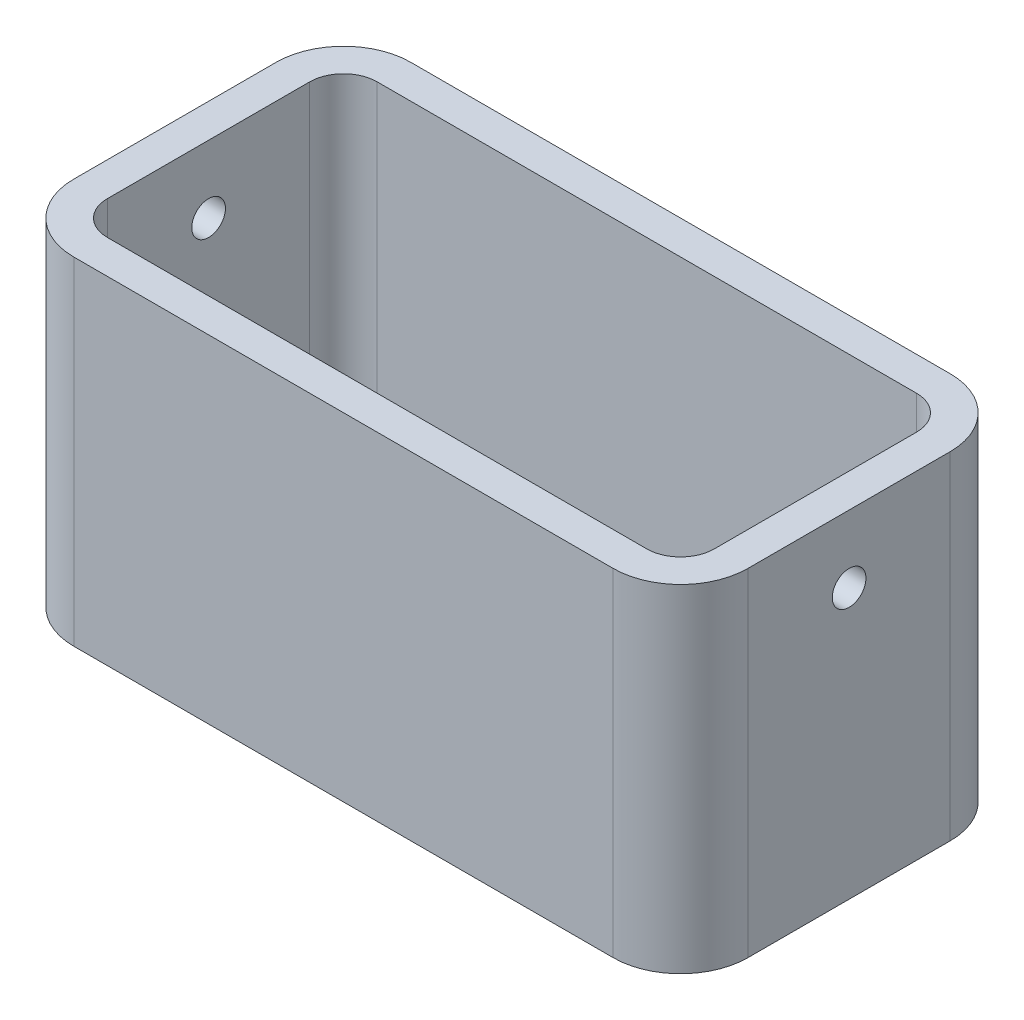
ISO-10303-21;
HEADER;
FILE_DESCRIPTION(('STEP AP214'),'2;1');
FILE_NAME('part.step','',(''),(''),'','','');
FILE_SCHEMA(('AUTOMOTIVE_DESIGN { 1 0 10303 214 1 1 1 1 }'));
ENDSEC;
DATA;
#1=APPLICATION_CONTEXT('core data for automotive mechanical design processes');
#2=APPLICATION_PROTOCOL_DEFINITION('international standard','automotive_design',2000,#1);
#3=PRODUCT_CONTEXT('',#1,'mechanical');
#4=PRODUCT('Part','Part','',(#3));
#5=PRODUCT_RELATED_PRODUCT_CATEGORY('part','',(#4));
#6=PRODUCT_DEFINITION_FORMATION('','',#4);
#7=PRODUCT_DEFINITION_CONTEXT('part definition',#1,'design');
#8=PRODUCT_DEFINITION('design','',#6,#7);
#9=PRODUCT_DEFINITION_SHAPE('','',#8);
#10=(LENGTH_UNIT() NAMED_UNIT(*) SI_UNIT(.MILLI.,.METRE.));
#11=(NAMED_UNIT(*) PLANE_ANGLE_UNIT() SI_UNIT($,.RADIAN.));
#12=(NAMED_UNIT(*) SI_UNIT($,.STERADIAN.) SOLID_ANGLE_UNIT());
#13=UNCERTAINTY_MEASURE_WITH_UNIT(LENGTH_MEASURE(1.E-05),#10,'distance_accuracy_value','');
#14=(GEOMETRIC_REPRESENTATION_CONTEXT(3) GLOBAL_UNCERTAINTY_ASSIGNED_CONTEXT((#13)) GLOBAL_UNIT_ASSIGNED_CONTEXT((#10,
#11,#12)) REPRESENTATION_CONTEXT('',''));
#15=CARTESIAN_POINT('',(0.,0.,0.));
#16=DIRECTION('',(0.,0.,1.));
#17=DIRECTION('',(1.,0.,0.));
#18=AXIS2_PLACEMENT_3D('',#15,#16,#17);
#19=CARTESIAN_POINT('',(-50.,50.,-25.));
#20=DIRECTION('',(1.,0.,0.));
#21=DIRECTION('',(0.,0.,-1.));
#22=AXIS2_PLACEMENT_3D('',#19,#20,#21);
#23=PLANE('',#22);
#24=CARTESIAN_POINT('',(-50.,40.,0.));
#25=DIRECTION('',(1.,0.,0.));
#26=DIRECTION('',(0.,0.,-1.));
#27=AXIS2_PLACEMENT_3D('',#24,#25,#26);
#28=CIRCLE('',#27,2.5);
#29=CARTESIAN_POINT('',(-50.,40.,-2.49999999999999));
#30=VERTEX_POINT('',#29);
#31=EDGE_CURVE('E500',#30,#30,#28,.T.);
#32=ORIENTED_EDGE('',*,*,#31,.T.);
#33=EDGE_LOOP('',(#32));
#34=FACE_BOUND('',#33,.T.);
#35=DIRECTION('',(0.,0.,1.));
#36=VECTOR('',#35,1.);
#37=CARTESIAN_POINT('',(-50.,0.,-25.));
#38=LINE('',#37,#36);
#39=CARTESIAN_POINT('',(-50.,0.,-15.));
#40=VERTEX_POINT('',#39);
#41=CARTESIAN_POINT('',(-50.,0.,15.));
#42=VERTEX_POINT('',#41);
#43=EDGE_CURVE('E206',#40,#42,#38,.T.);
#44=ORIENTED_EDGE('',*,*,#43,.T.);
#45=DIRECTION('',(0.,-1.,0.));
#46=VECTOR('',#45,1.);
#47=CARTESIAN_POINT('',(-50.,50.,15.));
#48=LINE('',#47,#46);
#49=CARTESIAN_POINT('',(-50.,50.,15.));
#50=VERTEX_POINT('',#49);
#51=EDGE_CURVE('E261',#42,#50,#48,.F.);
#52=ORIENTED_EDGE('',*,*,#51,.T.);
#53=DIRECTION('',(0.,0.,1.));
#54=VECTOR('',#53,1.);
#55=CARTESIAN_POINT('',(-50.,50.,-25.));
#56=LINE('',#55,#54);
#57=CARTESIAN_POINT('',(-50.,50.,-15.));
#58=VERTEX_POINT('',#57);
#59=EDGE_CURVE('E224',#58,#50,#56,.T.);
#60=ORIENTED_EDGE('',*,*,#59,.F.);
#61=DIRECTION('',(0.,-1.,0.));
#62=VECTOR('',#61,1.);
#63=CARTESIAN_POINT('',(-50.,50.,-15.));
#64=LINE('',#63,#62);
#65=EDGE_CURVE('E258',#58,#40,#64,.T.);
#66=ORIENTED_EDGE('',*,*,#65,.T.);
#67=EDGE_LOOP('',(#44,#52,#60,#66));
#68=FACE_BOUND('',#67,.T.);
#69=ADVANCED_FACE('F35',(#34,#68),#23,.F.);
#70=CARTESIAN_POINT('',(-50.,50.,25.));
#71=DIRECTION('',(0.,0.,-1.));
#72=DIRECTION('',(-1.,0.,0.));
#73=AXIS2_PLACEMENT_3D('',#70,#71,#72);
#74=PLANE('',#73);
#75=DIRECTION('',(1.,0.,0.));
#76=VECTOR('',#75,1.);
#77=CARTESIAN_POINT('',(-50.,50.,25.));
#78=LINE('',#77,#76);
#79=CARTESIAN_POINT('',(-40.,50.,25.));
#80=VERTEX_POINT('',#79);
#81=CARTESIAN_POINT('',(40.,50.,25.));
#82=VERTEX_POINT('',#81);
#83=EDGE_CURVE('E227',#80,#82,#78,.T.);
#84=ORIENTED_EDGE('',*,*,#83,.F.);
#85=DIRECTION('',(0.,-1.,0.));
#86=VECTOR('',#85,1.);
#87=CARTESIAN_POINT('',(-40.,50.,25.));
#88=LINE('',#87,#86);
#89=CARTESIAN_POINT('',(-40.,0.,25.));
#90=VERTEX_POINT('',#89);
#91=EDGE_CURVE('E247',#80,#90,#88,.T.);
#92=ORIENTED_EDGE('',*,*,#91,.T.);
#93=DIRECTION('',(1.,0.,0.));
#94=VECTOR('',#93,1.);
#95=CARTESIAN_POINT('',(-50.,0.,25.));
#96=LINE('',#95,#94);
#97=CARTESIAN_POINT('',(40.,0.,25.));
#98=VERTEX_POINT('',#97);
#99=EDGE_CURVE('E239',#90,#98,#96,.T.);
#100=ORIENTED_EDGE('',*,*,#99,.T.);
#101=DIRECTION('',(0.,-1.,0.));
#102=VECTOR('',#101,1.);
#103=CARTESIAN_POINT('',(40.,50.,25.));
#104=LINE('',#103,#102);
#105=EDGE_CURVE('E236',#98,#82,#104,.F.);
#106=ORIENTED_EDGE('',*,*,#105,.T.);
#107=EDGE_LOOP('',(#84,#92,#100,#106));
#108=FACE_BOUND('',#107,.T.);
#109=ADVANCED_FACE('F309',(#108),#74,.F.);
#110=CARTESIAN_POINT('',(50.,50.,-25.));
#111=DIRECTION('',(-1.,0.,0.));
#112=DIRECTION('',(0.,0.,1.));
#113=AXIS2_PLACEMENT_3D('',#110,#111,#112);
#114=PLANE('',#113);
#115=CARTESIAN_POINT('',(50.,40.,0.));
#116=DIRECTION('',(1.,0.,0.));
#117=DIRECTION('',(0.,0.,-1.));
#118=AXIS2_PLACEMENT_3D('',#115,#116,#117);
#119=CIRCLE('',#118,2.5);
#120=CARTESIAN_POINT('',(50.,40.,-2.50000000000001));
#121=VERTEX_POINT('',#120);
#122=EDGE_CURVE('E501',#121,#121,#119,.T.);
#123=ORIENTED_EDGE('',*,*,#122,.F.);
#124=EDGE_LOOP('',(#123));
#125=FACE_BOUND('',#124,.T.);
#126=DIRECTION('',(0.,0.,-1.));
#127=VECTOR('',#126,1.);
#128=CARTESIAN_POINT('',(50.,0.,-25.));
#129=LINE('',#128,#127);
#130=CARTESIAN_POINT('',(50.,0.,15.));
#131=VERTEX_POINT('',#130);
#132=CARTESIAN_POINT('',(50.,0.,-15.));
#133=VERTEX_POINT('',#132);
#134=EDGE_CURVE('E242',#131,#133,#129,.T.);
#135=ORIENTED_EDGE('',*,*,#134,.T.);
#136=DIRECTION('',(0.,-1.,0.));
#137=VECTOR('',#136,1.);
#138=CARTESIAN_POINT('',(50.,50.,-15.));
#139=LINE('',#138,#137);
#140=CARTESIAN_POINT('',(50.,50.,-15.));
#141=VERTEX_POINT('',#140);
#142=EDGE_CURVE('E11',#133,#141,#139,.F.);
#143=ORIENTED_EDGE('',*,*,#142,.T.);
#144=DIRECTION('',(0.,0.,-1.));
#145=VECTOR('',#144,1.);
#146=CARTESIAN_POINT('',(50.,50.,-25.));
#147=LINE('',#146,#145);
#148=CARTESIAN_POINT('',(50.,50.,15.));
#149=VERTEX_POINT('',#148);
#150=EDGE_CURVE('E231',#149,#141,#147,.T.);
#151=ORIENTED_EDGE('',*,*,#150,.F.);
#152=DIRECTION('',(0.,-1.,0.));
#153=VECTOR('',#152,1.);
#154=CARTESIAN_POINT('',(50.,50.,15.));
#155=LINE('',#154,#153);
#156=EDGE_CURVE('E44',#149,#131,#155,.T.);
#157=ORIENTED_EDGE('',*,*,#156,.T.);
#158=EDGE_LOOP('',(#135,#143,#151,#157));
#159=FACE_BOUND('',#158,.T.);
#160=ADVANCED_FACE('F280',(#125,#159),#114,.F.);
#161=CARTESIAN_POINT('',(-50.,50.,-25.));
#162=DIRECTION('',(0.,0.,1.));
#163=DIRECTION('',(1.,0.,0.));
#164=AXIS2_PLACEMENT_3D('',#161,#162,#163);
#165=PLANE('',#164);
#166=DIRECTION('',(-1.,0.,0.));
#167=VECTOR('',#166,1.);
#168=CARTESIAN_POINT('',(-50.,0.,-25.));
#169=LINE('',#168,#167);
#170=CARTESIAN_POINT('',(40.,0.,-25.));
#171=VERTEX_POINT('',#170);
#172=CARTESIAN_POINT('',(-40.,0.,-25.));
#173=VERTEX_POINT('',#172);
#174=EDGE_CURVE('E228',#171,#173,#169,.T.);
#175=ORIENTED_EDGE('',*,*,#174,.T.);
#176=DIRECTION('',(0.,-1.,0.));
#177=VECTOR('',#176,1.);
#178=CARTESIAN_POINT('',(-40.,50.,-25.));
#179=LINE('',#178,#177);
#180=CARTESIAN_POINT('',(-40.,50.,-25.));
#181=VERTEX_POINT('',#180);
#182=EDGE_CURVE('E59',#173,#181,#179,.F.);
#183=ORIENTED_EDGE('',*,*,#182,.T.);
#184=DIRECTION('',(-1.,0.,0.));
#185=VECTOR('',#184,1.);
#186=CARTESIAN_POINT('',(-50.,50.,-25.));
#187=LINE('',#186,#185);
#188=CARTESIAN_POINT('',(40.,50.,-25.));
#189=VERTEX_POINT('',#188);
#190=EDGE_CURVE('E234',#189,#181,#187,.T.);
#191=ORIENTED_EDGE('',*,*,#190,.F.);
#192=DIRECTION('',(0.,-1.,0.));
#193=VECTOR('',#192,1.);
#194=CARTESIAN_POINT('',(40.,50.,-25.));
#195=LINE('',#194,#193);
#196=EDGE_CURVE('E271',#189,#171,#195,.T.);
#197=ORIENTED_EDGE('',*,*,#196,.T.);
#198=EDGE_LOOP('',(#175,#183,#191,#197));
#199=FACE_BOUND('',#198,.T.);
#200=ADVANCED_FACE('F292',(#199),#165,.F.);
#201=CARTESIAN_POINT('',(-50.,50.,25.));
#202=DIRECTION('',(0.,1.,0.));
#203=DIRECTION('',(0.,0.,1.));
#204=AXIS2_PLACEMENT_3D('',#201,#202,#203);
#205=PLANE('',#204);
#206=DIRECTION('',(0.,0.,1.));
#207=VECTOR('',#206,1.);
#208=CARTESIAN_POINT('',(-45.,50.,-25.));
#209=LINE('',#208,#207);
#210=CARTESIAN_POINT('',(-45.,50.,-15.));
#211=VERTEX_POINT('',#210);
#212=CARTESIAN_POINT('',(-45.,50.,15.));
#213=VERTEX_POINT('',#212);
#214=EDGE_CURVE('E177',#211,#213,#209,.T.);
#215=ORIENTED_EDGE('',*,*,#214,.F.);
#216=CARTESIAN_POINT('',(-40.,50.,-15.));
#217=DIRECTION('',(0.,1.,0.));
#218=DIRECTION('',(0.,0.,1.));
#219=AXIS2_PLACEMENT_3D('',#216,#217,#218);
#220=CIRCLE('',#219,5.);
#221=CARTESIAN_POINT('',(-40.,50.,-20.));
#222=VERTEX_POINT('',#221);
#223=EDGE_CURVE('E215',#222,#211,#220,.T.);
#224=ORIENTED_EDGE('',*,*,#223,.F.);
#225=DIRECTION('',(-1.,0.,0.));
#226=VECTOR('',#225,1.);
#227=CARTESIAN_POINT('',(-50.,50.,-20.));
#228=LINE('',#227,#226);
#229=CARTESIAN_POINT('',(40.,50.,-20.));
#230=VERTEX_POINT('',#229);
#231=EDGE_CURVE('E51',#230,#222,#228,.T.);
#232=ORIENTED_EDGE('',*,*,#231,.F.);
#233=CARTESIAN_POINT('',(40.,50.,-15.));
#234=DIRECTION('',(0.,1.,0.));
#235=DIRECTION('',(0.,0.,1.));
#236=AXIS2_PLACEMENT_3D('',#233,#234,#235);
#237=CIRCLE('',#236,5.);
#238=CARTESIAN_POINT('',(45.,50.,-15.));
#239=VERTEX_POINT('',#238);
#240=EDGE_CURVE('E181',#239,#230,#237,.T.);
#241=ORIENTED_EDGE('',*,*,#240,.F.);
#242=DIRECTION('',(0.,0.,-1.));
#243=VECTOR('',#242,1.);
#244=CARTESIAN_POINT('',(45.,50.,-25.));
#245=LINE('',#244,#243);
#246=CARTESIAN_POINT('',(45.,50.,15.));
#247=VERTEX_POINT('',#246);
#248=EDGE_CURVE('E217',#247,#239,#245,.T.);
#249=ORIENTED_EDGE('',*,*,#248,.F.);
#250=CARTESIAN_POINT('',(40.,50.,15.));
#251=DIRECTION('',(0.,1.,0.));
#252=DIRECTION('',(0.,0.,1.));
#253=AXIS2_PLACEMENT_3D('',#250,#251,#252);
#254=CIRCLE('',#253,5.);
#255=CARTESIAN_POINT('',(40.,50.,20.));
#256=VERTEX_POINT('',#255);
#257=EDGE_CURVE('E179',#256,#247,#254,.T.);
#258=ORIENTED_EDGE('',*,*,#257,.F.);
#259=DIRECTION('',(1.,0.,0.));
#260=VECTOR('',#259,1.);
#261=CARTESIAN_POINT('',(-50.,50.,20.));
#262=LINE('',#261,#260);
#263=CARTESIAN_POINT('',(-40.,50.,20.));
#264=VERTEX_POINT('',#263);
#265=EDGE_CURVE('E213',#264,#256,#262,.T.);
#266=ORIENTED_EDGE('',*,*,#265,.F.);
#267=CARTESIAN_POINT('',(-40.,50.,15.));
#268=DIRECTION('',(0.,1.,0.));
#269=DIRECTION('',(0.,0.,1.));
#270=AXIS2_PLACEMENT_3D('',#267,#268,#269);
#271=CIRCLE('',#270,5.);
#272=EDGE_CURVE('E210',#213,#264,#271,.T.);
#273=ORIENTED_EDGE('',*,*,#272,.F.);
#274=EDGE_LOOP('',(#215,#224,#232,#241,#249,#258,#266,#273));
#275=FACE_BOUND('',#274,.T.);
#276=ORIENTED_EDGE('',*,*,#59,.T.);
#277=CARTESIAN_POINT('',(-40.,50.,15.));
#278=DIRECTION('',(0.,1.,0.));
#279=DIRECTION('',(0.,0.,1.));
#280=AXIS2_PLACEMENT_3D('',#277,#278,#279);
#281=CIRCLE('',#280,10.);
#282=EDGE_CURVE('E269',#50,#80,#281,.T.);
#283=ORIENTED_EDGE('',*,*,#282,.T.);
#284=ORIENTED_EDGE('',*,*,#83,.T.);
#285=CARTESIAN_POINT('',(40.,50.,15.));
#286=DIRECTION('',(0.,1.,0.));
#287=DIRECTION('',(0.,0.,1.));
#288=AXIS2_PLACEMENT_3D('',#285,#286,#287);
#289=CIRCLE('',#288,10.);
#290=EDGE_CURVE('E263',#82,#149,#289,.T.);
#291=ORIENTED_EDGE('',*,*,#290,.T.);
#292=ORIENTED_EDGE('',*,*,#150,.T.);
#293=CARTESIAN_POINT('',(40.,50.,-15.));
#294=DIRECTION('',(0.,1.,0.));
#295=DIRECTION('',(0.,0.,1.));
#296=AXIS2_PLACEMENT_3D('',#293,#294,#295);
#297=CIRCLE('',#296,10.);
#298=EDGE_CURVE('E265',#141,#189,#297,.T.);
#299=ORIENTED_EDGE('',*,*,#298,.T.);
#300=ORIENTED_EDGE('',*,*,#190,.T.);
#301=CARTESIAN_POINT('',(-40.,50.,-15.));
#302=DIRECTION('',(0.,1.,0.));
#303=DIRECTION('',(0.,0.,1.));
#304=AXIS2_PLACEMENT_3D('',#301,#302,#303);
#305=CIRCLE('',#304,10.);
#306=EDGE_CURVE('E267',#181,#58,#305,.T.);
#307=ORIENTED_EDGE('',*,*,#306,.T.);
#308=EDGE_LOOP('',(#276,#283,#284,#291,#292,#299,#300,#307));
#309=FACE_BOUND('',#308,.T.);
#310=ADVANCED_FACE('F295',(#275,#309),#205,.T.);
#311=CARTESIAN_POINT('',(-50.,0.,25.));
#312=DIRECTION('',(0.,1.,0.));
#313=DIRECTION('',(0.,0.,1.));
#314=AXIS2_PLACEMENT_3D('',#311,#312,#313);
#315=PLANE('',#314);
#316=ORIENTED_EDGE('',*,*,#99,.F.);
#317=CARTESIAN_POINT('',(-40.,0.,15.));
#318=DIRECTION('',(0.,1.,0.));
#319=DIRECTION('',(0.,0.,1.));
#320=AXIS2_PLACEMENT_3D('',#317,#318,#319);
#321=CIRCLE('',#320,10.);
#322=EDGE_CURVE('E256',#90,#42,#321,.F.);
#323=ORIENTED_EDGE('',*,*,#322,.T.);
#324=ORIENTED_EDGE('',*,*,#43,.F.);
#325=CARTESIAN_POINT('',(-40.,0.,-15.));
#326=DIRECTION('',(0.,1.,0.));
#327=DIRECTION('',(0.,0.,1.));
#328=AXIS2_PLACEMENT_3D('',#325,#326,#327);
#329=CIRCLE('',#328,10.);
#330=EDGE_CURVE('E254',#40,#173,#329,.F.);
#331=ORIENTED_EDGE('',*,*,#330,.T.);
#332=ORIENTED_EDGE('',*,*,#174,.F.);
#333=CARTESIAN_POINT('',(40.,0.,-15.));
#334=DIRECTION('',(0.,1.,0.));
#335=DIRECTION('',(0.,0.,1.));
#336=AXIS2_PLACEMENT_3D('',#333,#334,#335);
#337=CIRCLE('',#336,10.);
#338=EDGE_CURVE('E252',#171,#133,#337,.F.);
#339=ORIENTED_EDGE('',*,*,#338,.T.);
#340=ORIENTED_EDGE('',*,*,#134,.F.);
#341=CARTESIAN_POINT('',(40.,0.,15.));
#342=DIRECTION('',(0.,1.,0.));
#343=DIRECTION('',(0.,0.,1.));
#344=AXIS2_PLACEMENT_3D('',#341,#342,#343);
#345=CIRCLE('',#344,10.);
#346=EDGE_CURVE('E250',#131,#98,#345,.F.);
#347=ORIENTED_EDGE('',*,*,#346,.T.);
#348=EDGE_LOOP('',(#316,#323,#324,#331,#332,#339,#340,#347));
#349=FACE_BOUND('',#348,.T.);
#350=ADVANCED_FACE('F286',(#349),#315,.F.);
#351=CARTESIAN_POINT('',(-40.,50.,15.));
#352=DIRECTION('',(0.,-1.,0.));
#353=DIRECTION('',(0.,0.,-1.));
#354=AXIS2_PLACEMENT_3D('',#351,#352,#353);
#355=CYLINDRICAL_SURFACE('',#354,10.);
#356=ORIENTED_EDGE('',*,*,#282,.F.);
#357=ORIENTED_EDGE('',*,*,#51,.F.);
#358=ORIENTED_EDGE('',*,*,#322,.F.);
#359=ORIENTED_EDGE('',*,*,#91,.F.);
#360=EDGE_LOOP('',(#356,#357,#358,#359));
#361=FACE_BOUND('',#360,.T.);
#362=ADVANCED_FACE('F306',(#361),#355,.T.);
#363=CARTESIAN_POINT('',(-40.,50.,-15.));
#364=DIRECTION('',(0.,-1.,0.));
#365=DIRECTION('',(0.,0.,-1.));
#366=AXIS2_PLACEMENT_3D('',#363,#364,#365);
#367=CYLINDRICAL_SURFACE('',#366,10.);
#368=ORIENTED_EDGE('',*,*,#306,.F.);
#369=ORIENTED_EDGE('',*,*,#182,.F.);
#370=ORIENTED_EDGE('',*,*,#330,.F.);
#371=ORIENTED_EDGE('',*,*,#65,.F.);
#372=EDGE_LOOP('',(#368,#369,#370,#371));
#373=FACE_BOUND('',#372,.T.);
#374=ADVANCED_FACE('F299',(#373),#367,.T.);
#375=CARTESIAN_POINT('',(40.,50.,-15.));
#376=DIRECTION('',(0.,-1.,0.));
#377=DIRECTION('',(0.,0.,-1.));
#378=AXIS2_PLACEMENT_3D('',#375,#376,#377);
#379=CYLINDRICAL_SURFACE('',#378,10.);
#380=ORIENTED_EDGE('',*,*,#298,.F.);
#381=ORIENTED_EDGE('',*,*,#142,.F.);
#382=ORIENTED_EDGE('',*,*,#338,.F.);
#383=ORIENTED_EDGE('',*,*,#196,.F.);
#384=EDGE_LOOP('',(#380,#381,#382,#383));
#385=FACE_BOUND('',#384,.T.);
#386=ADVANCED_FACE('F291',(#385),#379,.T.);
#387=CARTESIAN_POINT('',(40.,50.,15.));
#388=DIRECTION('',(0.,-1.,0.));
#389=DIRECTION('',(0.,0.,-1.));
#390=AXIS2_PLACEMENT_3D('',#387,#388,#389);
#391=CYLINDRICAL_SURFACE('',#390,10.);
#392=ORIENTED_EDGE('',*,*,#290,.F.);
#393=ORIENTED_EDGE('',*,*,#105,.F.);
#394=ORIENTED_EDGE('',*,*,#346,.F.);
#395=ORIENTED_EDGE('',*,*,#156,.F.);
#396=EDGE_LOOP('',(#392,#393,#394,#395));
#397=FACE_BOUND('',#396,.T.);
#398=ADVANCED_FACE('F37',(#397),#391,.T.);
#399=CARTESIAN_POINT('',(-45.,50.,-25.));
#400=DIRECTION('',(1.,0.,0.));
#401=DIRECTION('',(0.,0.,-1.));
#402=AXIS2_PLACEMENT_3D('',#399,#400,#401);
#403=PLANE('',#402);
#404=CARTESIAN_POINT('',(-45.,40.,0.));
#405=DIRECTION('',(1.,0.,0.));
#406=DIRECTION('',(0.,0.,-1.));
#407=AXIS2_PLACEMENT_3D('',#404,#405,#406);
#408=CIRCLE('',#407,2.5);
#409=CARTESIAN_POINT('',(-45.,40.,-2.5));
#410=VERTEX_POINT('',#409);
#411=EDGE_CURVE('E173',#410,#410,#408,.T.);
#412=ORIENTED_EDGE('',*,*,#411,.F.);
#413=EDGE_LOOP('',(#412));
#414=FACE_BOUND('',#413,.T.);
#415=DIRECTION('',(0.,0.,1.));
#416=VECTOR('',#415,1.);
#417=CARTESIAN_POINT('',(-45.,5.,-25.));
#418=LINE('',#417,#416);
#419=CARTESIAN_POINT('',(-45.,5.,-15.));
#420=VERTEX_POINT('',#419);
#421=CARTESIAN_POINT('',(-45.,5.,15.));
#422=VERTEX_POINT('',#421);
#423=EDGE_CURVE('E166',#420,#422,#418,.T.);
#424=ORIENTED_EDGE('',*,*,#423,.F.);
#425=DIRECTION('',(0.,1.,0.));
#426=VECTOR('',#425,1.);
#427=CARTESIAN_POINT('',(-45.,50.,-15.));
#428=LINE('',#427,#426);
#429=EDGE_CURVE('E162',#211,#420,#428,.F.);
#430=ORIENTED_EDGE('',*,*,#429,.F.);
#431=ORIENTED_EDGE('',*,*,#214,.T.);
#432=DIRECTION('',(0.,1.,0.));
#433=VECTOR('',#432,1.);
#434=CARTESIAN_POINT('',(-45.,50.,15.));
#435=LINE('',#434,#433);
#436=EDGE_CURVE('E155',#422,#213,#435,.T.);
#437=ORIENTED_EDGE('',*,*,#436,.F.);
#438=EDGE_LOOP('',(#424,#430,#431,#437));
#439=FACE_BOUND('',#438,.T.);
#440=ADVANCED_FACE('F175',(#414,#439),#403,.T.);
#441=CARTESIAN_POINT('',(-50.,50.,20.));
#442=DIRECTION('',(0.,0.,-1.));
#443=DIRECTION('',(-1.,0.,0.));
#444=AXIS2_PLACEMENT_3D('',#441,#442,#443);
#445=PLANE('',#444);
#446=ORIENTED_EDGE('',*,*,#265,.T.);
#447=DIRECTION('',(0.,1.,0.));
#448=VECTOR('',#447,1.);
#449=CARTESIAN_POINT('',(40.,50.,20.));
#450=LINE('',#449,#448);
#451=CARTESIAN_POINT('',(40.,5.,20.));
#452=VERTEX_POINT('',#451);
#453=EDGE_CURVE('E198',#452,#256,#450,.T.);
#454=ORIENTED_EDGE('',*,*,#453,.F.);
#455=DIRECTION('',(1.,0.,0.));
#456=VECTOR('',#455,1.);
#457=CARTESIAN_POINT('',(-50.,5.,20.));
#458=LINE('',#457,#456);
#459=CARTESIAN_POINT('',(-40.,5.,20.));
#460=VERTEX_POINT('',#459);
#461=EDGE_CURVE('E172',#460,#452,#458,.T.);
#462=ORIENTED_EDGE('',*,*,#461,.F.);
#463=DIRECTION('',(0.,1.,0.));
#464=VECTOR('',#463,1.);
#465=CARTESIAN_POINT('',(-40.,50.,20.));
#466=LINE('',#465,#464);
#467=EDGE_CURVE('E158',#264,#460,#466,.F.);
#468=ORIENTED_EDGE('',*,*,#467,.F.);
#469=EDGE_LOOP('',(#446,#454,#462,#468));
#470=FACE_BOUND('',#469,.T.);
#471=ADVANCED_FACE('F316',(#470),#445,.T.);
#472=CARTESIAN_POINT('',(45.,50.,-25.));
#473=DIRECTION('',(-1.,0.,0.));
#474=DIRECTION('',(0.,0.,1.));
#475=AXIS2_PLACEMENT_3D('',#472,#473,#474);
#476=PLANE('',#475);
#477=CARTESIAN_POINT('',(45.,40.,0.));
#478=DIRECTION('',(-1.,0.,0.));
#479=DIRECTION('',(0.,0.,1.));
#480=AXIS2_PLACEMENT_3D('',#477,#478,#479);
#481=CIRCLE('',#480,2.5);
#482=CARTESIAN_POINT('',(45.,40.,2.5));
#483=VERTEX_POINT('',#482);
#484=EDGE_CURVE('E39',#483,#483,#481,.T.);
#485=ORIENTED_EDGE('',*,*,#484,.F.);
#486=EDGE_LOOP('',(#485));
#487=FACE_BOUND('',#486,.T.);
#488=DIRECTION('',(0.,0.,-1.));
#489=VECTOR('',#488,1.);
#490=CARTESIAN_POINT('',(45.,5.,-25.));
#491=LINE('',#490,#489);
#492=CARTESIAN_POINT('',(45.,5.,15.));
#493=VERTEX_POINT('',#492);
#494=CARTESIAN_POINT('',(45.,5.,-15.));
#495=VERTEX_POINT('',#494);
#496=EDGE_CURVE('E186',#493,#495,#491,.T.);
#497=ORIENTED_EDGE('',*,*,#496,.F.);
#498=DIRECTION('',(0.,1.,0.));
#499=VECTOR('',#498,1.);
#500=CARTESIAN_POINT('',(45.,50.,15.));
#501=LINE('',#500,#499);
#502=EDGE_CURVE('E200',#247,#493,#501,.F.);
#503=ORIENTED_EDGE('',*,*,#502,.F.);
#504=ORIENTED_EDGE('',*,*,#248,.T.);
#505=DIRECTION('',(0.,1.,0.));
#506=VECTOR('',#505,1.);
#507=CARTESIAN_POINT('',(45.,50.,-15.));
#508=LINE('',#507,#506);
#509=EDGE_CURVE('E203',#495,#239,#508,.T.);
#510=ORIENTED_EDGE('',*,*,#509,.F.);
#511=EDGE_LOOP('',(#497,#503,#504,#510));
#512=FACE_BOUND('',#511,.T.);
#513=ADVANCED_FACE('F367',(#487,#512),#476,.T.);
#514=CARTESIAN_POINT('',(-50.,50.,-20.));
#515=DIRECTION('',(0.,0.,1.));
#516=DIRECTION('',(1.,0.,0.));
#517=AXIS2_PLACEMENT_3D('',#514,#515,#516);
#518=PLANE('',#517);
#519=DIRECTION('',(-1.,0.,0.));
#520=VECTOR('',#519,1.);
#521=CARTESIAN_POINT('',(-50.,5.,-20.));
#522=LINE('',#521,#520);
#523=CARTESIAN_POINT('',(40.,5.,-20.));
#524=VERTEX_POINT('',#523);
#525=CARTESIAN_POINT('',(-40.,5.,-20.));
#526=VERTEX_POINT('',#525);
#527=EDGE_CURVE('E190',#524,#526,#522,.T.);
#528=ORIENTED_EDGE('',*,*,#527,.F.);
#529=DIRECTION('',(0.,1.,0.));
#530=VECTOR('',#529,1.);
#531=CARTESIAN_POINT('',(40.,50.,-20.));
#532=LINE('',#531,#530);
#533=EDGE_CURVE('E207',#230,#524,#532,.F.);
#534=ORIENTED_EDGE('',*,*,#533,.F.);
#535=ORIENTED_EDGE('',*,*,#231,.T.);
#536=DIRECTION('',(0.,1.,0.));
#537=VECTOR('',#536,1.);
#538=CARTESIAN_POINT('',(-40.,50.,-20.));
#539=LINE('',#538,#537);
#540=EDGE_CURVE('E204',#526,#222,#539,.T.);
#541=ORIENTED_EDGE('',*,*,#540,.F.);
#542=EDGE_LOOP('',(#528,#534,#535,#541));
#543=FACE_BOUND('',#542,.T.);
#544=ADVANCED_FACE('F375',(#543),#518,.T.);
#545=CARTESIAN_POINT('',(-50.,5.,25.));
#546=DIRECTION('',(0.,1.,0.));
#547=DIRECTION('',(0.,0.,1.));
#548=AXIS2_PLACEMENT_3D('',#545,#546,#547);
#549=PLANE('',#548);
#550=ORIENTED_EDGE('',*,*,#461,.T.);
#551=CARTESIAN_POINT('',(40.,5.,15.));
#552=DIRECTION('',(0.,1.,0.));
#553=DIRECTION('',(0.,0.,1.));
#554=AXIS2_PLACEMENT_3D('',#551,#552,#553);
#555=CIRCLE('',#554,5.);
#556=EDGE_CURVE('E193',#493,#452,#555,.F.);
#557=ORIENTED_EDGE('',*,*,#556,.F.);
#558=ORIENTED_EDGE('',*,*,#496,.T.);
#559=CARTESIAN_POINT('',(40.,5.,-15.));
#560=DIRECTION('',(0.,1.,0.));
#561=DIRECTION('',(0.,0.,1.));
#562=AXIS2_PLACEMENT_3D('',#559,#560,#561);
#563=CIRCLE('',#562,5.);
#564=EDGE_CURVE('E189',#524,#495,#563,.F.);
#565=ORIENTED_EDGE('',*,*,#564,.F.);
#566=ORIENTED_EDGE('',*,*,#527,.T.);
#567=CARTESIAN_POINT('',(-40.,5.,-15.));
#568=DIRECTION('',(0.,1.,0.));
#569=DIRECTION('',(0.,0.,1.));
#570=AXIS2_PLACEMENT_3D('',#567,#568,#569);
#571=CIRCLE('',#570,5.);
#572=EDGE_CURVE('E163',#420,#526,#571,.F.);
#573=ORIENTED_EDGE('',*,*,#572,.F.);
#574=ORIENTED_EDGE('',*,*,#423,.T.);
#575=CARTESIAN_POINT('',(-40.,5.,15.));
#576=DIRECTION('',(0.,1.,0.));
#577=DIRECTION('',(0.,0.,1.));
#578=AXIS2_PLACEMENT_3D('',#575,#576,#577);
#579=CIRCLE('',#578,5.);
#580=EDGE_CURVE('E151',#460,#422,#579,.F.);
#581=ORIENTED_EDGE('',*,*,#580,.F.);
#582=EDGE_LOOP('',(#550,#557,#558,#565,#566,#573,#574,#581));
#583=FACE_BOUND('',#582,.T.);
#584=ADVANCED_FACE('F167',(#583),#549,.T.);
#585=CARTESIAN_POINT('',(-40.,50.,15.));
#586=DIRECTION('',(0.,-1.,0.));
#587=DIRECTION('',(0.,0.,-1.));
#588=AXIS2_PLACEMENT_3D('',#585,#586,#587);
#589=CYLINDRICAL_SURFACE('',#588,5.);
#590=ORIENTED_EDGE('',*,*,#272,.T.);
#591=ORIENTED_EDGE('',*,*,#467,.T.);
#592=ORIENTED_EDGE('',*,*,#580,.T.);
#593=ORIENTED_EDGE('',*,*,#436,.T.);
#594=EDGE_LOOP('',(#590,#591,#592,#593));
#595=FACE_BOUND('',#594,.T.);
#596=ADVANCED_FACE('F153',(#595),#589,.F.);
#597=CARTESIAN_POINT('',(-40.,50.,-15.));
#598=DIRECTION('',(0.,-1.,0.));
#599=DIRECTION('',(0.,0.,-1.));
#600=AXIS2_PLACEMENT_3D('',#597,#598,#599);
#601=CYLINDRICAL_SURFACE('',#600,5.);
#602=ORIENTED_EDGE('',*,*,#223,.T.);
#603=ORIENTED_EDGE('',*,*,#429,.T.);
#604=ORIENTED_EDGE('',*,*,#572,.T.);
#605=ORIENTED_EDGE('',*,*,#540,.T.);
#606=EDGE_LOOP('',(#602,#603,#604,#605));
#607=FACE_BOUND('',#606,.T.);
#608=ADVANCED_FACE('F396',(#607),#601,.F.);
#609=CARTESIAN_POINT('',(40.,50.,-15.));
#610=DIRECTION('',(0.,-1.,0.));
#611=DIRECTION('',(0.,0.,-1.));
#612=AXIS2_PLACEMENT_3D('',#609,#610,#611);
#613=CYLINDRICAL_SURFACE('',#612,5.);
#614=ORIENTED_EDGE('',*,*,#240,.T.);
#615=ORIENTED_EDGE('',*,*,#533,.T.);
#616=ORIENTED_EDGE('',*,*,#564,.T.);
#617=ORIENTED_EDGE('',*,*,#509,.T.);
#618=EDGE_LOOP('',(#614,#615,#616,#617));
#619=FACE_BOUND('',#618,.T.);
#620=ADVANCED_FACE('F405',(#619),#613,.F.);
#621=CARTESIAN_POINT('',(40.,50.,15.));
#622=DIRECTION('',(0.,-1.,0.));
#623=DIRECTION('',(0.,0.,-1.));
#624=AXIS2_PLACEMENT_3D('',#621,#622,#623);
#625=CYLINDRICAL_SURFACE('',#624,5.);
#626=ORIENTED_EDGE('',*,*,#257,.T.);
#627=ORIENTED_EDGE('',*,*,#502,.T.);
#628=ORIENTED_EDGE('',*,*,#556,.T.);
#629=ORIENTED_EDGE('',*,*,#453,.T.);
#630=EDGE_LOOP('',(#626,#627,#628,#629));
#631=FACE_BOUND('',#630,.T.);
#632=ADVANCED_FACE('F415',(#631),#625,.F.);
#633=CARTESIAN_POINT('',(-50.,40.,0.));
#634=DIRECTION('',(1.,0.,0.));
#635=DIRECTION('',(0.,0.,-1.));
#636=AXIS2_PLACEMENT_3D('',#633,#634,#635);
#637=CYLINDRICAL_SURFACE('',#636,2.5);
#638=ORIENTED_EDGE('',*,*,#484,.T.);
#639=EDGE_LOOP('',(#638));
#640=FACE_BOUND('',#639,.T.);
#641=ORIENTED_EDGE('',*,*,#122,.T.);
#642=EDGE_LOOP('',(#641));
#643=FACE_BOUND('',#642,.T.);
#644=ADVANCED_FACE('F424',(#640,#643),#637,.F.);
#645=ORIENTED_EDGE('',*,*,#411,.T.);
#646=EDGE_LOOP('',(#645));
#647=FACE_BOUND('',#646,.T.);
#648=ORIENTED_EDGE('',*,*,#31,.F.);
#649=EDGE_LOOP('',(#648));
#650=FACE_BOUND('',#649,.T.);
#651=ADVANCED_FACE('F460',(#647,#650),#637,.F.);
#652=CLOSED_SHELL('',(#69,#109,#160,#200,#310,#350,#362,#374,#386,#398,#440,#471,#513,#544,#584,
#596,#608,#620,#632,#644,#651));
#653=MANIFOLD_SOLID_BREP('B2',#652);
#654=ADVANCED_BREP_SHAPE_REPRESENTATION('',(#18,#653),#14);
#655=SHAPE_DEFINITION_REPRESENTATION(#9,#654);
ENDSEC;
END-ISO-10303-21;
